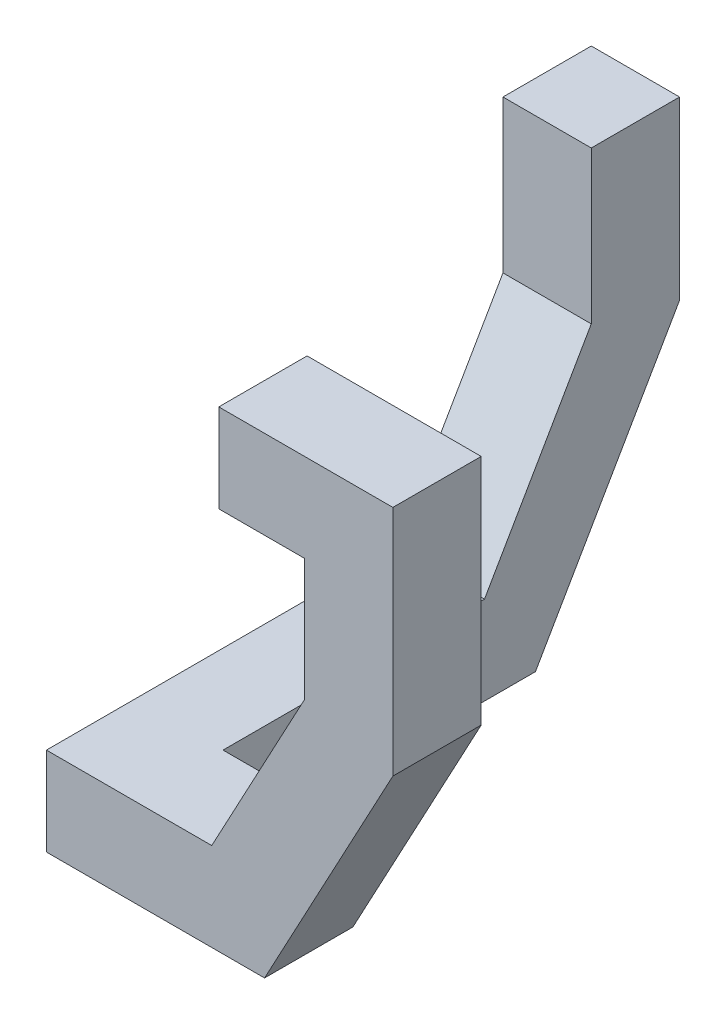
ISO-10303-21;
HEADER;
FILE_DESCRIPTION(('STEP AP214'),'2;1');
FILE_NAME('part.step','',(''),(''),'','','');
FILE_SCHEMA(('AUTOMOTIVE_DESIGN { 1 0 10303 214 1 1 1 1 }'));
ENDSEC;
DATA;
#1=APPLICATION_CONTEXT('core data for automotive mechanical design processes');
#2=APPLICATION_PROTOCOL_DEFINITION('international standard','automotive_design',2000,#1);
#3=PRODUCT_CONTEXT('',#1,'mechanical');
#4=PRODUCT('Part','Part','',(#3));
#5=PRODUCT_RELATED_PRODUCT_CATEGORY('part','',(#4));
#6=PRODUCT_DEFINITION_FORMATION('','',#4);
#7=PRODUCT_DEFINITION_CONTEXT('part definition',#1,'design');
#8=PRODUCT_DEFINITION('design','',#6,#7);
#9=PRODUCT_DEFINITION_SHAPE('','',#8);
#10=(LENGTH_UNIT() NAMED_UNIT(*) SI_UNIT(.MILLI.,.METRE.));
#11=(NAMED_UNIT(*) PLANE_ANGLE_UNIT() SI_UNIT($,.RADIAN.));
#12=(NAMED_UNIT(*) SI_UNIT($,.STERADIAN.) SOLID_ANGLE_UNIT());
#13=UNCERTAINTY_MEASURE_WITH_UNIT(LENGTH_MEASURE(1.E-05),#10,'distance_accuracy_value','');
#14=(GEOMETRIC_REPRESENTATION_CONTEXT(3) GLOBAL_UNCERTAINTY_ASSIGNED_CONTEXT((#13)) GLOBAL_UNIT_ASSIGNED_CONTEXT((#10,
#11,#12)) REPRESENTATION_CONTEXT('',''));
#15=CARTESIAN_POINT('',(0.,0.,0.));
#16=DIRECTION('',(0.,0.,1.));
#17=DIRECTION('',(1.,0.,0.));
#18=AXIS2_PLACEMENT_3D('',#15,#16,#17);
#19=CARTESIAN_POINT('',(-2.5,-6.22861113877289,5.));
#20=DIRECTION('',(0.,0.,1.));
#21=DIRECTION('',(1.,0.,0.));
#22=AXIS2_PLACEMENT_3D('',#19,#20,#21);
#23=PLANE('',#22);
#24=DIRECTION('',(1.,0.,0.));
#25=VECTOR('',#24,1.);
#26=CARTESIAN_POINT('',(-2.5,-6.22861113877289,5.));
#27=LINE('',#26,#25);
#28=CARTESIAN_POINT('',(-2.5,-6.22861113877289,5.));
#29=VERTEX_POINT('',#28);
#30=CARTESIAN_POINT('',(2.5,-6.22861113877289,5.));
#31=VERTEX_POINT('',#30);
#32=EDGE_CURVE('E42',#29,#31,#27,.T.);
#33=ORIENTED_EDGE('',*,*,#32,.T.);
#34=DIRECTION('',(0.,-1.,0.));
#35=VECTOR('',#34,1.);
#36=CARTESIAN_POINT('',(2.5,-6.22861113877289,5.));
#37=LINE('',#36,#35);
#38=CARTESIAN_POINT('',(2.5,2.39735518324579,5.));
#39=VERTEX_POINT('',#38);
#40=EDGE_CURVE('E237',#39,#31,#37,.T.);
#41=ORIENTED_EDGE('',*,*,#40,.F.);
#42=DIRECTION('',(1.,0.,0.));
#43=VECTOR('',#42,1.);
#44=CARTESIAN_POINT('',(-2.5,2.39735518324579,5.));
#45=LINE('',#44,#43);
#46=CARTESIAN_POINT('',(-2.5,2.39735518324579,5.));
#47=VERTEX_POINT('',#46);
#48=EDGE_CURVE('E11',#47,#39,#45,.T.);
#49=ORIENTED_EDGE('',*,*,#48,.F.);
#50=DIRECTION('',(0.,-1.,0.));
#51=VECTOR('',#50,1.);
#52=CARTESIAN_POINT('',(-2.5,-6.22861113877289,5.));
#53=LINE('',#52,#51);
#54=EDGE_CURVE('E261',#47,#29,#53,.T.);
#55=ORIENTED_EDGE('',*,*,#54,.T.);
#56=EDGE_LOOP('',(#33,#41,#49,#55));
#57=FACE_BOUND('',#56,.T.);
#58=ADVANCED_FACE('F39',(#57),#23,.T.);
#59=CARTESIAN_POINT('',(-2.5,2.39735518324579,5.));
#60=DIRECTION('',(0.,1.,0.));
#61=DIRECTION('',(0.,0.,1.));
#62=AXIS2_PLACEMENT_3D('',#59,#60,#61);
#63=PLANE('',#62);
#64=ORIENTED_EDGE('',*,*,#48,.T.);
#65=DIRECTION('',(0.,0.,1.));
#66=VECTOR('',#65,1.);
#67=CARTESIAN_POINT('',(2.5,2.39735518324579,5.));
#68=LINE('',#67,#66);
#69=CARTESIAN_POINT('',(2.5,2.39735518324579,0.));
#70=VERTEX_POINT('',#69);
#71=EDGE_CURVE('E258',#70,#39,#68,.T.);
#72=ORIENTED_EDGE('',*,*,#71,.F.);
#73=DIRECTION('',(1.,0.,0.));
#74=VECTOR('',#73,1.);
#75=CARTESIAN_POINT('',(-2.5,2.39735518324579,0.));
#76=LINE('',#75,#74);
#77=CARTESIAN_POINT('',(-2.5,2.39735518324579,0.));
#78=VERTEX_POINT('',#77);
#79=EDGE_CURVE('E47',#78,#70,#76,.T.);
#80=ORIENTED_EDGE('',*,*,#79,.F.);
#81=DIRECTION('',(0.,0.,1.));
#82=VECTOR('',#81,1.);
#83=CARTESIAN_POINT('',(-2.5,2.39735518324579,5.));
#84=LINE('',#83,#82);
#85=EDGE_CURVE('E270',#78,#47,#84,.T.);
#86=ORIENTED_EDGE('',*,*,#85,.T.);
#87=EDGE_LOOP('',(#64,#72,#80,#86));
#88=FACE_BOUND('',#87,.T.);
#89=ADVANCED_FACE('F282',(#88),#63,.T.);
#90=CARTESIAN_POINT('',(-2.5,2.39735518324579,0.));
#91=DIRECTION('',(0.,0.,-1.));
#92=DIRECTION('',(0.,1.,0.));
#93=AXIS2_PLACEMENT_3D('',#90,#91,#92);
#94=PLANE('',#93);
#95=ORIENTED_EDGE('',*,*,#79,.T.);
#96=DIRECTION('',(0.,1.,0.));
#97=VECTOR('',#96,1.);
#98=CARTESIAN_POINT('',(2.5,2.39735518324579,0.));
#99=LINE('',#98,#97);
#100=CARTESIAN_POINT('',(2.5,-7.56835710092849,0.));
#101=VERTEX_POINT('',#100);
#102=EDGE_CURVE('E255',#101,#70,#99,.T.);
#103=ORIENTED_EDGE('',*,*,#102,.F.);
#104=DIRECTION('',(1.,0.,0.));
#105=VECTOR('',#104,1.);
#106=CARTESIAN_POINT('',(-2.5,-7.56835710092849,0.));
#107=LINE('',#106,#105);
#108=CARTESIAN_POINT('',(-2.5,-7.56835710092849,0.));
#109=VERTEX_POINT('',#108);
#110=EDGE_CURVE('E273',#109,#101,#107,.T.);
#111=ORIENTED_EDGE('',*,*,#110,.F.);
#112=DIRECTION('',(0.,1.,0.));
#113=VECTOR('',#112,1.);
#114=CARTESIAN_POINT('',(-2.5,2.39735518324579,0.));
#115=LINE('',#114,#113);
#116=EDGE_CURVE('E268',#109,#78,#115,.T.);
#117=ORIENTED_EDGE('',*,*,#116,.T.);
#118=EDGE_LOOP('',(#95,#103,#111,#117));
#119=FACE_BOUND('',#118,.T.);
#120=ADVANCED_FACE('F341',(#119),#94,.T.);
#121=CARTESIAN_POINT('',(-2.5,-7.56835710092849,0.));
#122=DIRECTION('',(0.,-0.499999999999998,-0.86602540378444));
#123=DIRECTION('',(0.,0.86602540378444,-0.499999999999998));
#124=AXIS2_PLACEMENT_3D('',#121,#122,#123);
#125=PLANE('',#124);
#126=ORIENTED_EDGE('',*,*,#110,.T.);
#127=DIRECTION('',(0.,0.86602540378444,-0.499999999999998));
#128=VECTOR('',#127,1.);
#129=CARTESIAN_POINT('',(2.5,-7.56835710092849,0.));
#130=LINE('',#129,#128);
#131=CARTESIAN_POINT('',(2.5,-21.7021988260987,8.1601773247105));
#132=VERTEX_POINT('',#131);
#133=EDGE_CURVE('E252',#132,#101,#130,.T.);
#134=ORIENTED_EDGE('',*,*,#133,.F.);
#135=DIRECTION('',(1.,0.,0.));
#136=VECTOR('',#135,1.);
#137=CARTESIAN_POINT('',(-2.5,-21.7021988260987,8.1601773247105));
#138=LINE('',#137,#136);
#139=CARTESIAN_POINT('',(-2.5,-21.7021988260987,8.1601773247105));
#140=VERTEX_POINT('',#139);
#141=EDGE_CURVE('E275',#140,#132,#138,.T.);
#142=ORIENTED_EDGE('',*,*,#141,.F.);
#143=DIRECTION('',(0.,0.86602540378444,-0.499999999999998));
#144=VECTOR('',#143,1.);
#145=CARTESIAN_POINT('',(-2.5,-7.56835710092849,0.));
#146=LINE('',#145,#144);
#147=EDGE_CURVE('E265',#140,#109,#146,.T.);
#148=ORIENTED_EDGE('',*,*,#147,.T.);
#149=EDGE_LOOP('',(#126,#134,#142,#148));
#150=FACE_BOUND('',#149,.T.);
#151=ADVANCED_FACE('F287',(#150),#125,.T.);
#152=CARTESIAN_POINT('',(-2.5,-21.7021988260987,8.1601773247105));
#153=DIRECTION('',(0.,-1.,0.));
#154=DIRECTION('',(0.,0.,-1.));
#155=AXIS2_PLACEMENT_3D('',#152,#153,#154);
#156=PLANE('',#155);
#157=ORIENTED_EDGE('',*,*,#141,.T.);
#158=DIRECTION('',(0.,0.,-1.));
#159=VECTOR('',#158,1.);
#160=CARTESIAN_POINT('',(2.5,-21.7021988260987,8.1601773247105));
#161=LINE('',#160,#159);
#162=CARTESIAN_POINT('',(2.5,-21.7021988260987,25.8496586224101));
#163=VERTEX_POINT('',#162);
#164=EDGE_CURVE('E249',#163,#132,#161,.T.);
#165=ORIENTED_EDGE('',*,*,#164,.F.);
#166=DIRECTION('',(1.,0.,0.));
#167=VECTOR('',#166,1.);
#168=CARTESIAN_POINT('',(9.85108205891265,-21.7021988260987,25.8496586224101));
#169=LINE('',#168,#167);
#170=CARTESIAN_POINT('',(9.85108205891265,-21.7021988260987,25.8496586224101));
#171=VERTEX_POINT('',#170);
#172=EDGE_CURVE('E200',#163,#171,#169,.T.);
#173=ORIENTED_EDGE('',*,*,#172,.T.);
#174=DIRECTION('',(0.,0.,-1.));
#175=VECTOR('',#174,1.);
#176=CARTESIAN_POINT('',(9.85108205891265,-21.7021988260987,30.8496586224101));
#177=LINE('',#176,#175);
#178=CARTESIAN_POINT('',(9.85108205891265,-21.7021988260987,30.8496586224101));
#179=VERTEX_POINT('',#178);
#180=EDGE_CURVE('E234',#179,#171,#177,.T.);
#181=ORIENTED_EDGE('',*,*,#180,.F.);
#182=DIRECTION('',(1.,0.,0.));
#183=VECTOR('',#182,1.);
#184=CARTESIAN_POINT('',(5.,-21.7021988260987,30.8496586224101));
#185=LINE('',#184,#183);
#186=CARTESIAN_POINT('',(-2.5,-21.7021988260987,30.8496586224101));
#187=VERTEX_POINT('',#186);
#188=EDGE_CURVE('E173',#187,#179,#185,.T.);
#189=ORIENTED_EDGE('',*,*,#188,.F.);
#190=DIRECTION('',(0.,0.,-1.));
#191=VECTOR('',#190,1.);
#192=CARTESIAN_POINT('',(-2.5,-21.7021988260987,8.1601773247105));
#193=LINE('',#192,#191);
#194=EDGE_CURVE('E163',#187,#140,#193,.T.);
#195=ORIENTED_EDGE('',*,*,#194,.T.);
#196=EDGE_LOOP('',(#157,#165,#173,#181,#189,#195));
#197=FACE_BOUND('',#196,.T.);
#198=ADVANCED_FACE('F291',(#197),#156,.T.);
#199=CARTESIAN_POINT('',(-2.5,-16.7021988260987,25.8496586224101));
#200=DIRECTION('',(0.,1.,0.));
#201=DIRECTION('',(0.,0.,1.));
#202=AXIS2_PLACEMENT_3D('',#199,#200,#201);
#203=PLANE('',#202);
#204=DIRECTION('',(0.,0.,1.));
#205=VECTOR('',#204,1.);
#206=CARTESIAN_POINT('',(-2.5,-16.7021988260987,25.8496586224101));
#207=LINE('',#206,#205);
#208=CARTESIAN_POINT('',(-2.5,-16.7021988260987,11.0469286706586));
#209=VERTEX_POINT('',#208);
#210=CARTESIAN_POINT('',(-2.5,-16.7021988260987,30.8496586224101));
#211=VERTEX_POINT('',#210);
#212=EDGE_CURVE('E151',#209,#211,#207,.T.);
#213=ORIENTED_EDGE('',*,*,#212,.T.);
#214=DIRECTION('',(-1.,0.,0.));
#215=VECTOR('',#214,1.);
#216=CARTESIAN_POINT('',(-2.5,-16.7021988260987,30.8496586224101));
#217=LINE('',#216,#215);
#218=CARTESIAN_POINT('',(6.8603713936298,-16.7021988260987,30.8496586224101));
#219=VERTEX_POINT('',#218);
#220=EDGE_CURVE('E156',#219,#211,#217,.T.);
#221=ORIENTED_EDGE('',*,*,#220,.F.);
#222=DIRECTION('',(0.,0.,-1.));
#223=VECTOR('',#222,1.);
#224=CARTESIAN_POINT('',(6.8603713936298,-16.7021988260987,30.8496586224101));
#225=LINE('',#224,#223);
#226=CARTESIAN_POINT('',(6.8603713936298,-16.7021988260987,25.8496586224101));
#227=VERTEX_POINT('',#226);
#228=EDGE_CURVE('E199',#219,#227,#225,.T.);
#229=ORIENTED_EDGE('',*,*,#228,.T.);
#230=DIRECTION('',(-1.,0.,0.));
#231=VECTOR('',#230,1.);
#232=CARTESIAN_POINT('',(5.,-16.7021988260987,25.8496586224101));
#233=LINE('',#232,#231);
#234=CARTESIAN_POINT('',(2.5,-16.7021988260987,25.8496586224101));
#235=VERTEX_POINT('',#234);
#236=EDGE_CURVE('E179',#227,#235,#233,.T.);
#237=ORIENTED_EDGE('',*,*,#236,.T.);
#238=DIRECTION('',(0.,0.,1.));
#239=VECTOR('',#238,1.);
#240=CARTESIAN_POINT('',(2.5,-16.7021988260987,25.8496586224101));
#241=LINE('',#240,#239);
#242=CARTESIAN_POINT('',(2.5,-16.7021988260987,11.0469286706586));
#243=VERTEX_POINT('',#242);
#244=EDGE_CURVE('E243',#243,#235,#241,.T.);
#245=ORIENTED_EDGE('',*,*,#244,.F.);
#246=DIRECTION('',(1.,0.,0.));
#247=VECTOR('',#246,1.);
#248=CARTESIAN_POINT('',(-2.5,-16.7021988260987,11.0469286706586));
#249=LINE('',#248,#247);
#250=EDGE_CURVE('E159',#209,#243,#249,.T.);
#251=ORIENTED_EDGE('',*,*,#250,.F.);
#252=EDGE_LOOP('',(#213,#221,#229,#237,#245,#251));
#253=FACE_BOUND('',#252,.T.);
#254=ADVANCED_FACE('F153',(#253),#203,.T.);
#255=CARTESIAN_POINT('',(-2.5,-16.7021988260987,11.0469286706586));
#256=DIRECTION('',(0.,0.499999999999998,0.86602540378444));
#257=DIRECTION('',(0.,-0.86602540378444,0.499999999999998));
#258=AXIS2_PLACEMENT_3D('',#255,#256,#257);
#259=PLANE('',#258);
#260=ORIENTED_EDGE('',*,*,#250,.T.);
#261=DIRECTION('',(0.,-0.86602540378444,0.499999999999998));
#262=VECTOR('',#261,1.);
#263=CARTESIAN_POINT('',(2.5,-16.7021988260987,11.0469286706586));
#264=LINE('',#263,#262);
#265=EDGE_CURVE('E240',#31,#243,#264,.T.);
#266=ORIENTED_EDGE('',*,*,#265,.F.);
#267=ORIENTED_EDGE('',*,*,#32,.F.);
#268=DIRECTION('',(0.,-0.86602540378444,0.499999999999998));
#269=VECTOR('',#268,1.);
#270=CARTESIAN_POINT('',(-2.5,-16.7021988260987,11.0469286706586));
#271=LINE('',#270,#269);
#272=EDGE_CURVE('E164',#29,#209,#271,.T.);
#273=ORIENTED_EDGE('',*,*,#272,.T.);
#274=EDGE_LOOP('',(#260,#266,#267,#273));
#275=FACE_BOUND('',#274,.T.);
#276=ADVANCED_FACE('F278',(#275),#259,.T.);
#277=CARTESIAN_POINT('',(-2.5,0.,0.));
#278=DIRECTION('',(-1.,0.,0.));
#279=DIRECTION('',(0.,0.,1.));
#280=AXIS2_PLACEMENT_3D('',#277,#278,#279);
#281=PLANE('',#280);
#282=ORIENTED_EDGE('',*,*,#54,.F.);
#283=ORIENTED_EDGE('',*,*,#85,.F.);
#284=ORIENTED_EDGE('',*,*,#116,.F.);
#285=ORIENTED_EDGE('',*,*,#147,.F.);
#286=ORIENTED_EDGE('',*,*,#194,.F.);
#287=DIRECTION('',(0.,-1.,0.));
#288=VECTOR('',#287,1.);
#289=CARTESIAN_POINT('',(-2.5,-21.7021988260987,30.8496586224101));
#290=LINE('',#289,#288);
#291=EDGE_CURVE('E167',#211,#187,#290,.T.);
#292=ORIENTED_EDGE('',*,*,#291,.F.);
#293=ORIENTED_EDGE('',*,*,#212,.F.);
#294=ORIENTED_EDGE('',*,*,#272,.F.);
#295=EDGE_LOOP('',(#282,#283,#284,#285,#286,#292,#293,#294));
#296=FACE_BOUND('',#295,.T.);
#297=ADVANCED_FACE('F168',(#296),#281,.T.);
#298=CARTESIAN_POINT('',(2.5,0.,0.));
#299=DIRECTION('',(-1.,0.,0.));
#300=DIRECTION('',(0.,0.,1.));
#301=AXIS2_PLACEMENT_3D('',#298,#299,#300);
#302=PLANE('',#301);
#303=ORIENTED_EDGE('',*,*,#40,.T.);
#304=ORIENTED_EDGE('',*,*,#265,.T.);
#305=ORIENTED_EDGE('',*,*,#244,.T.);
#306=DIRECTION('',(0.,-1.,0.));
#307=VECTOR('',#306,1.);
#308=CARTESIAN_POINT('',(2.5,-21.7021988260987,25.8496586224101));
#309=LINE('',#308,#307);
#310=EDGE_CURVE('E246',#235,#163,#309,.T.);
#311=ORIENTED_EDGE('',*,*,#310,.T.);
#312=ORIENTED_EDGE('',*,*,#164,.T.);
#313=ORIENTED_EDGE('',*,*,#133,.T.);
#314=ORIENTED_EDGE('',*,*,#102,.T.);
#315=ORIENTED_EDGE('',*,*,#71,.T.);
#316=EDGE_LOOP('',(#303,#304,#305,#311,#312,#313,#314,#315));
#317=FACE_BOUND('',#316,.T.);
#318=ADVANCED_FACE('F280',(#317),#302,.F.);
#319=CARTESIAN_POINT('',(17.1164242732021,-8.16893369464186,30.8496586224101));
#320=DIRECTION('',(-0.881062869169774,0.472999176077852,0.));
#321=DIRECTION('',(-0.472999176077852,-0.881062869169774,0.));
#322=AXIS2_PLACEMENT_3D('',#319,#320,#321);
#323=PLANE('',#322);
#324=DIRECTION('',(0.472999176077851,0.881062869169774,0.));
#325=VECTOR('',#324,1.);
#326=CARTESIAN_POINT('',(17.1164242732021,-8.16893369464186,25.8496586224101));
#327=LINE('',#326,#325);
#328=CARTESIAN_POINT('',(17.1164242732021,-8.16893369464186,25.8496586224101));
#329=VERTEX_POINT('',#328);
#330=EDGE_CURVE('E202',#171,#329,#327,.T.);
#331=ORIENTED_EDGE('',*,*,#330,.T.);
#332=DIRECTION('',(0.,0.,-1.));
#333=VECTOR('',#332,1.);
#334=CARTESIAN_POINT('',(17.1164242732021,-8.16893369464186,30.8496586224101));
#335=LINE('',#334,#333);
#336=CARTESIAN_POINT('',(17.1164242732021,-8.16893369464186,30.8496586224101));
#337=VERTEX_POINT('',#336);
#338=EDGE_CURVE('E231',#337,#329,#335,.T.);
#339=ORIENTED_EDGE('',*,*,#338,.F.);
#340=DIRECTION('',(0.472999176077851,0.881062869169774,0.));
#341=VECTOR('',#340,1.);
#342=CARTESIAN_POINT('',(17.1164242732021,-8.16893369464186,30.8496586224101));
#343=LINE('',#342,#341);
#344=EDGE_CURVE('E186',#179,#337,#343,.T.);
#345=ORIENTED_EDGE('',*,*,#344,.F.);
#346=ORIENTED_EDGE('',*,*,#180,.T.);
#347=EDGE_LOOP('',(#331,#339,#345,#346));
#348=FACE_BOUND('',#347,.T.);
#349=ADVANCED_FACE('F327',(#348),#323,.F.);
#350=CARTESIAN_POINT('',(17.1164242732021,5.00610405399471,30.8496586224101));
#351=DIRECTION('',(-1.,0.,0.));
#352=DIRECTION('',(0.,0.,1.));
#353=AXIS2_PLACEMENT_3D('',#350,#351,#352);
#354=PLANE('',#353);
#355=DIRECTION('',(0.,1.,0.));
#356=VECTOR('',#355,1.);
#357=CARTESIAN_POINT('',(17.1164242732021,5.00610405399471,25.8496586224101));
#358=LINE('',#357,#356);
#359=CARTESIAN_POINT('',(17.1164242732021,5.00610405399471,25.8496586224101));
#360=VERTEX_POINT('',#359);
#361=EDGE_CURVE('E204',#329,#360,#358,.T.);
#362=ORIENTED_EDGE('',*,*,#361,.T.);
#363=DIRECTION('',(0.,0.,-1.));
#364=VECTOR('',#363,1.);
#365=CARTESIAN_POINT('',(17.1164242732021,5.00610405399471,30.8496586224101));
#366=LINE('',#365,#364);
#367=CARTESIAN_POINT('',(17.1164242732021,5.00610405399471,30.8496586224101));
#368=VERTEX_POINT('',#367);
#369=EDGE_CURVE('E228',#368,#360,#366,.T.);
#370=ORIENTED_EDGE('',*,*,#369,.F.);
#371=DIRECTION('',(0.,1.,0.));
#372=VECTOR('',#371,1.);
#373=CARTESIAN_POINT('',(17.1164242732021,5.00610405399471,30.8496586224101));
#374=LINE('',#373,#372);
#375=EDGE_CURVE('E188',#337,#368,#374,.T.);
#376=ORIENTED_EDGE('',*,*,#375,.F.);
#377=ORIENTED_EDGE('',*,*,#338,.T.);
#378=EDGE_LOOP('',(#362,#370,#376,#377));
#379=FACE_BOUND('',#378,.T.);
#380=ADVANCED_FACE('F323',(#379),#354,.F.);
#381=CARTESIAN_POINT('',(7.25957932248811,5.00610405399471,30.8496586224101));
#382=DIRECTION('',(0.,-1.,0.));
#383=DIRECTION('',(0.,0.,-1.));
#384=AXIS2_PLACEMENT_3D('',#381,#382,#383);
#385=PLANE('',#384);
#386=DIRECTION('',(-1.,0.,0.));
#387=VECTOR('',#386,1.);
#388=CARTESIAN_POINT('',(7.25957932248811,5.00610405399471,25.8496586224101));
#389=LINE('',#388,#387);
#390=CARTESIAN_POINT('',(7.25957932248811,5.00610405399471,25.8496586224101));
#391=VERTEX_POINT('',#390);
#392=EDGE_CURVE('E206',#360,#391,#389,.T.);
#393=ORIENTED_EDGE('',*,*,#392,.T.);
#394=DIRECTION('',(0.,0.,-1.));
#395=VECTOR('',#394,1.);
#396=CARTESIAN_POINT('',(7.25957932248811,5.00610405399471,30.8496586224101));
#397=LINE('',#396,#395);
#398=CARTESIAN_POINT('',(7.25957932248811,5.00610405399471,30.8496586224101));
#399=VERTEX_POINT('',#398);
#400=EDGE_CURVE('E225',#399,#391,#397,.T.);
#401=ORIENTED_EDGE('',*,*,#400,.F.);
#402=DIRECTION('',(-1.,0.,0.));
#403=VECTOR('',#402,1.);
#404=CARTESIAN_POINT('',(7.25957932248811,5.00610405399471,30.8496586224101));
#405=LINE('',#404,#403);
#406=EDGE_CURVE('E190',#368,#399,#405,.T.);
#407=ORIENTED_EDGE('',*,*,#406,.F.);
#408=ORIENTED_EDGE('',*,*,#369,.T.);
#409=EDGE_LOOP('',(#393,#401,#407,#408));
#410=FACE_BOUND('',#409,.T.);
#411=ADVANCED_FACE('F318',(#410),#385,.F.);
#412=CARTESIAN_POINT('',(7.25957932248811,0.00610405399470437,30.8496586224101));
#413=DIRECTION('',(1.,0.,0.));
#414=DIRECTION('',(0.,0.,-1.));
#415=AXIS2_PLACEMENT_3D('',#412,#413,#414);
#416=PLANE('',#415);
#417=DIRECTION('',(0.,-1.,0.));
#418=VECTOR('',#417,1.);
#419=CARTESIAN_POINT('',(7.25957932248811,0.00610405399470437,25.8496586224101));
#420=LINE('',#419,#418);
#421=CARTESIAN_POINT('',(7.25957932248811,0.00610405399470437,25.8496586224101));
#422=VERTEX_POINT('',#421);
#423=EDGE_CURVE('E208',#391,#422,#420,.T.);
#424=ORIENTED_EDGE('',*,*,#423,.T.);
#425=DIRECTION('',(0.,0.,-1.));
#426=VECTOR('',#425,1.);
#427=CARTESIAN_POINT('',(7.25957932248811,0.00610405399470437,30.8496586224101));
#428=LINE('',#427,#426);
#429=CARTESIAN_POINT('',(7.25957932248811,0.00610405399470437,30.8496586224101));
#430=VERTEX_POINT('',#429);
#431=EDGE_CURVE('E222',#430,#422,#428,.T.);
#432=ORIENTED_EDGE('',*,*,#431,.F.);
#433=DIRECTION('',(0.,-1.,0.));
#434=VECTOR('',#433,1.);
#435=CARTESIAN_POINT('',(7.25957932248811,0.00610405399470437,30.8496586224101));
#436=LINE('',#435,#434);
#437=EDGE_CURVE('E192',#399,#430,#436,.T.);
#438=ORIENTED_EDGE('',*,*,#437,.F.);
#439=ORIENTED_EDGE('',*,*,#400,.T.);
#440=EDGE_LOOP('',(#424,#432,#438,#439));
#441=FACE_BOUND('',#440,.T.);
#442=ADVANCED_FACE('F313',(#441),#416,.F.);
#443=CARTESIAN_POINT('',(12.1164242732021,0.00610405399470481,30.8496586224101));
#444=DIRECTION('',(0.,1.,0.));
#445=DIRECTION('',(-1.,0.,0.));
#446=AXIS2_PLACEMENT_3D('',#443,#444,#445);
#447=PLANE('',#446);
#448=DIRECTION('',(1.,0.,0.));
#449=VECTOR('',#448,1.);
#450=CARTESIAN_POINT('',(12.1164242732021,0.00610405399470481,25.8496586224101));
#451=LINE('',#450,#449);
#452=CARTESIAN_POINT('',(12.1164242732021,0.00610405399470481,25.8496586224101));
#453=VERTEX_POINT('',#452);
#454=EDGE_CURVE('E210',#422,#453,#451,.T.);
#455=ORIENTED_EDGE('',*,*,#454,.T.);
#456=DIRECTION('',(0.,0.,-1.));
#457=VECTOR('',#456,1.);
#458=CARTESIAN_POINT('',(12.1164242732021,0.00610405399470481,30.8496586224101));
#459=LINE('',#458,#457);
#460=CARTESIAN_POINT('',(12.1164242732021,0.00610405399470481,30.8496586224101));
#461=VERTEX_POINT('',#460);
#462=EDGE_CURVE('E219',#461,#453,#459,.T.);
#463=ORIENTED_EDGE('',*,*,#462,.F.);
#464=DIRECTION('',(1.,0.,0.));
#465=VECTOR('',#464,1.);
#466=CARTESIAN_POINT('',(12.1164242732021,0.00610405399470481,30.8496586224101));
#467=LINE('',#466,#465);
#468=EDGE_CURVE('E194',#430,#461,#467,.T.);
#469=ORIENTED_EDGE('',*,*,#468,.F.);
#470=ORIENTED_EDGE('',*,*,#431,.T.);
#471=EDGE_LOOP('',(#455,#463,#469,#470));
#472=FACE_BOUND('',#471,.T.);
#473=ADVANCED_FACE('F309',(#472),#447,.F.);
#474=CARTESIAN_POINT('',(12.1164242732021,-6.91166796516995,30.8496586224101));
#475=DIRECTION('',(1.,0.,0.));
#476=DIRECTION('',(0.,0.,-1.));
#477=AXIS2_PLACEMENT_3D('',#474,#475,#476);
#478=PLANE('',#477);
#479=DIRECTION('',(0.,-1.,0.));
#480=VECTOR('',#479,1.);
#481=CARTESIAN_POINT('',(12.1164242732021,-6.91166796516995,25.8496586224101));
#482=LINE('',#481,#480);
#483=CARTESIAN_POINT('',(12.1164242732021,-6.91166796516995,25.8496586224101));
#484=VERTEX_POINT('',#483);
#485=EDGE_CURVE('E212',#453,#484,#482,.T.);
#486=ORIENTED_EDGE('',*,*,#485,.T.);
#487=DIRECTION('',(0.,0.,-1.));
#488=VECTOR('',#487,1.);
#489=CARTESIAN_POINT('',(12.1164242732021,-6.91166796516995,30.8496586224101));
#490=LINE('',#489,#488);
#491=CARTESIAN_POINT('',(12.1164242732021,-6.91166796516995,30.8496586224101));
#492=VERTEX_POINT('',#491);
#493=EDGE_CURVE('E216',#492,#484,#490,.T.);
#494=ORIENTED_EDGE('',*,*,#493,.F.);
#495=DIRECTION('',(0.,-1.,0.));
#496=VECTOR('',#495,1.);
#497=CARTESIAN_POINT('',(12.1164242732021,-6.91166796516995,30.8496586224101));
#498=LINE('',#497,#496);
#499=EDGE_CURVE('E196',#461,#492,#498,.T.);
#500=ORIENTED_EDGE('',*,*,#499,.F.);
#501=ORIENTED_EDGE('',*,*,#462,.T.);
#502=EDGE_LOOP('',(#486,#494,#500,#501));
#503=FACE_BOUND('',#502,.T.);
#504=ADVANCED_FACE('F304',(#503),#478,.F.);
#505=CARTESIAN_POINT('',(6.8603713936298,-16.7021988260987,30.8496586224101));
#506=DIRECTION('',(0.881062869169774,-0.472999176077852,0.));
#507=DIRECTION('',(0.472999176077852,0.881062869169774,0.));
#508=AXIS2_PLACEMENT_3D('',#505,#506,#507);
#509=PLANE('',#508);
#510=DIRECTION('',(-0.472999176077851,-0.881062869169774,0.));
#511=VECTOR('',#510,1.);
#512=CARTESIAN_POINT('',(6.8603713936298,-16.7021988260987,25.8496586224101));
#513=LINE('',#512,#511);
#514=EDGE_CURVE('E182',#484,#227,#513,.T.);
#515=ORIENTED_EDGE('',*,*,#514,.T.);
#516=ORIENTED_EDGE('',*,*,#228,.F.);
#517=DIRECTION('',(-0.472999176077851,-0.881062869169774,0.));
#518=VECTOR('',#517,1.);
#519=CARTESIAN_POINT('',(6.8603713936298,-16.7021988260987,30.8496586224101));
#520=LINE('',#519,#518);
#521=EDGE_CURVE('E177',#492,#219,#520,.T.);
#522=ORIENTED_EDGE('',*,*,#521,.F.);
#523=ORIENTED_EDGE('',*,*,#493,.T.);
#524=EDGE_LOOP('',(#515,#516,#522,#523));
#525=FACE_BOUND('',#524,.T.);
#526=ADVANCED_FACE('F298',(#525),#509,.F.);
#527=CARTESIAN_POINT('',(0.,0.,30.8496586224101));
#528=DIRECTION('',(0.,0.,1.));
#529=DIRECTION('',(1.,0.,0.));
#530=AXIS2_PLACEMENT_3D('',#527,#528,#529);
#531=PLANE('',#530);
#532=ORIENTED_EDGE('',*,*,#220,.T.);
#533=ORIENTED_EDGE('',*,*,#291,.T.);
#534=ORIENTED_EDGE('',*,*,#188,.T.);
#535=ORIENTED_EDGE('',*,*,#344,.T.);
#536=ORIENTED_EDGE('',*,*,#375,.T.);
#537=ORIENTED_EDGE('',*,*,#406,.T.);
#538=ORIENTED_EDGE('',*,*,#437,.T.);
#539=ORIENTED_EDGE('',*,*,#468,.T.);
#540=ORIENTED_EDGE('',*,*,#499,.T.);
#541=ORIENTED_EDGE('',*,*,#521,.T.);
#542=EDGE_LOOP('',(#532,#533,#534,#535,#536,#537,#538,#539,#540,#541));
#543=FACE_BOUND('',#542,.T.);
#544=ADVANCED_FACE('F175',(#543),#531,.T.);
#545=CARTESIAN_POINT('',(0.,0.,25.8496586224101));
#546=DIRECTION('',(0.,0.,1.));
#547=DIRECTION('',(1.,0.,0.));
#548=AXIS2_PLACEMENT_3D('',#545,#546,#547);
#549=PLANE('',#548);
#550=ORIENTED_EDGE('',*,*,#310,.F.);
#551=ORIENTED_EDGE('',*,*,#236,.F.);
#552=ORIENTED_EDGE('',*,*,#514,.F.);
#553=ORIENTED_EDGE('',*,*,#485,.F.);
#554=ORIENTED_EDGE('',*,*,#454,.F.);
#555=ORIENTED_EDGE('',*,*,#423,.F.);
#556=ORIENTED_EDGE('',*,*,#392,.F.);
#557=ORIENTED_EDGE('',*,*,#361,.F.);
#558=ORIENTED_EDGE('',*,*,#330,.F.);
#559=ORIENTED_EDGE('',*,*,#172,.F.);
#560=EDGE_LOOP('',(#550,#551,#552,#553,#554,#555,#556,#557,#558,#559));
#561=FACE_BOUND('',#560,.T.);
#562=ADVANCED_FACE('F294',(#561),#549,.F.);
#563=CLOSED_SHELL('',(#58,#89,#120,#151,#198,#254,#276,#297,#318,#349,#380,#411,#442,#473,#504,
#526,#544,#562));
#564=MANIFOLD_SOLID_BREP('B2',#563);
#565=ADVANCED_BREP_SHAPE_REPRESENTATION('',(#18,#564),#14);
#566=SHAPE_DEFINITION_REPRESENTATION(#9,#565);
ENDSEC;
END-ISO-10303-21;
